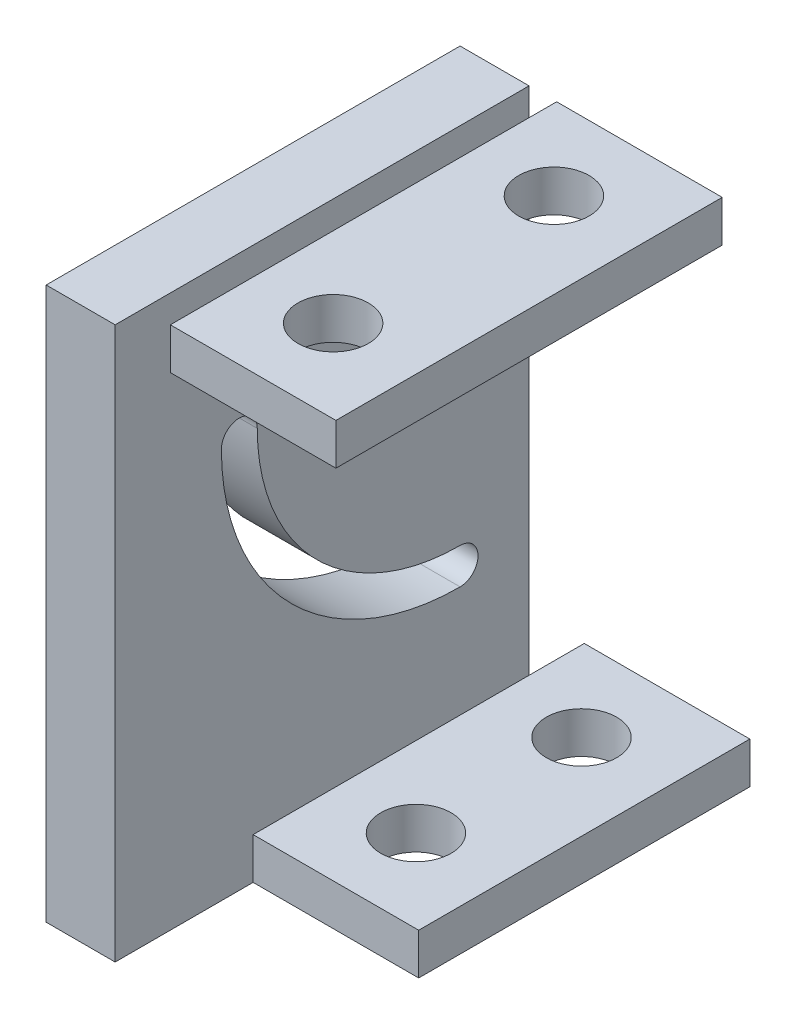
ISO-10303-21;
HEADER;
FILE_DESCRIPTION(('STEP AP214'),'2;1');
FILE_NAME('part.step','',(''),(''),'','','');
FILE_SCHEMA(('AUTOMOTIVE_DESIGN { 1 0 10303 214 1 1 1 1 }'));
ENDSEC;
DATA;
#1=APPLICATION_CONTEXT('core data for automotive mechanical design processes');
#2=APPLICATION_PROTOCOL_DEFINITION('international standard','automotive_design',2000,#1);
#3=PRODUCT_CONTEXT('',#1,'mechanical');
#4=PRODUCT('Part','Part','',(#3));
#5=PRODUCT_RELATED_PRODUCT_CATEGORY('part','',(#4));
#6=PRODUCT_DEFINITION_FORMATION('','',#4);
#7=PRODUCT_DEFINITION_CONTEXT('part definition',#1,'design');
#8=PRODUCT_DEFINITION('design','',#6,#7);
#9=PRODUCT_DEFINITION_SHAPE('','',#8);
#10=(LENGTH_UNIT() NAMED_UNIT(*) SI_UNIT(.MILLI.,.METRE.));
#11=(NAMED_UNIT(*) PLANE_ANGLE_UNIT() SI_UNIT($,.RADIAN.));
#12=(NAMED_UNIT(*) SI_UNIT($,.STERADIAN.) SOLID_ANGLE_UNIT());
#13=UNCERTAINTY_MEASURE_WITH_UNIT(LENGTH_MEASURE(1.E-05),#10,'distance_accuracy_value','');
#14=(GEOMETRIC_REPRESENTATION_CONTEXT(3) GLOBAL_UNCERTAINTY_ASSIGNED_CONTEXT((#13)) GLOBAL_UNIT_ASSIGNED_CONTEXT((#10,
#11,#12)) REPRESENTATION_CONTEXT('',''));
#15=CARTESIAN_POINT('',(0.,0.,0.));
#16=DIRECTION('',(0.,0.,1.));
#17=DIRECTION('',(1.,0.,0.));
#18=AXIS2_PLACEMENT_3D('',#15,#16,#17);
#19=CARTESIAN_POINT('',(27.2,17.,-2.));
#20=DIRECTION('',(1.,0.,0.));
#21=DIRECTION('',(0.,0.,-1.));
#22=AXIS2_PLACEMENT_3D('',#19,#20,#21);
#23=PLANE('',#22);
#24=DIRECTION('',(0.,0.,1.));
#25=VECTOR('',#24,1.);
#26=CARTESIAN_POINT('',(27.2,20.,-2.));
#27=LINE('',#26,#25);
#28=CARTESIAN_POINT('',(27.2,20.,26.));
#29=VERTEX_POINT('',#28);
#30=CARTESIAN_POINT('',(27.2,20.,-2.));
#31=VERTEX_POINT('',#30);
#32=EDGE_CURVE('E113',#29,#31,#27,.F.);
#33=ORIENTED_EDGE('',*,*,#32,.F.);
#34=DIRECTION('',(0.,1.,0.));
#35=VECTOR('',#34,1.);
#36=CARTESIAN_POINT('',(27.2,17.,26.));
#37=LINE('',#36,#35);
#38=CARTESIAN_POINT('',(27.2,17.,26.));
#39=VERTEX_POINT('',#38);
#40=EDGE_CURVE('E120',#39,#29,#37,.T.);
#41=ORIENTED_EDGE('',*,*,#40,.F.);
#42=DIRECTION('',(0.,0.,1.));
#43=VECTOR('',#42,1.);
#44=CARTESIAN_POINT('',(27.2,17.,-2.));
#45=LINE('',#44,#43);
#46=CARTESIAN_POINT('',(27.2,17.,-2.));
#47=VERTEX_POINT('',#46);
#48=EDGE_CURVE('E123',#39,#47,#45,.F.);
#49=ORIENTED_EDGE('',*,*,#48,.T.);
#50=DIRECTION('',(0.,1.,0.));
#51=VECTOR('',#50,1.);
#52=CARTESIAN_POINT('',(27.2,17.,-2.));
#53=LINE('',#52,#51);
#54=EDGE_CURVE('E134',#47,#31,#53,.T.);
#55=ORIENTED_EDGE('',*,*,#54,.T.);
#56=EDGE_LOOP('',(#33,#41,#49,#55));
#57=FACE_BOUND('',#56,.T.);
#58=ADVANCED_FACE('F15',(#57),#23,.T.);
#59=CARTESIAN_POINT('',(21.,20.,4.));
#60=DIRECTION('',(0.,1.,0.));
#61=DIRECTION('',(0.,0.,1.));
#62=AXIS2_PLACEMENT_3D('',#59,#60,#61);
#63=CYLINDRICAL_SURFACE('',#62,2.55);
#64=CARTESIAN_POINT('',(21.,17.,4.));
#65=DIRECTION('',(0.,1.,0.));
#66=DIRECTION('',(0.,0.,1.));
#67=AXIS2_PLACEMENT_3D('',#64,#65,#66);
#68=CIRCLE('',#67,2.55);
#69=CARTESIAN_POINT('',(21.,17.,6.55));
#70=VERTEX_POINT('',#69);
#71=EDGE_CURVE('E18',#70,#70,#68,.F.);
#72=ORIENTED_EDGE('',*,*,#71,.T.);
#73=EDGE_LOOP('',(#72));
#74=FACE_BOUND('',#73,.T.);
#75=CARTESIAN_POINT('',(21.,20.,4.));
#76=DIRECTION('',(0.,1.,0.));
#77=DIRECTION('',(0.,0.,1.));
#78=AXIS2_PLACEMENT_3D('',#75,#76,#77);
#79=CIRCLE('',#78,2.55);
#80=CARTESIAN_POINT('',(21.,20.,6.55));
#81=VERTEX_POINT('',#80);
#82=EDGE_CURVE('E111',#81,#81,#79,.F.);
#83=ORIENTED_EDGE('',*,*,#82,.F.);
#84=EDGE_LOOP('',(#83));
#85=FACE_BOUND('',#84,.T.);
#86=ADVANCED_FACE('F580',(#74,#85),#63,.F.);
#87=CARTESIAN_POINT('',(21.,20.,20.));
#88=DIRECTION('',(0.,1.,0.));
#89=DIRECTION('',(0.,0.,1.));
#90=AXIS2_PLACEMENT_3D('',#87,#88,#89);
#91=CYLINDRICAL_SURFACE('',#90,2.55);
#92=CARTESIAN_POINT('',(21.,17.,20.));
#93=DIRECTION('',(0.,1.,0.));
#94=DIRECTION('',(0.,0.,1.));
#95=AXIS2_PLACEMENT_3D('',#92,#93,#94);
#96=CIRCLE('',#95,2.55);
#97=CARTESIAN_POINT('',(21.,17.,22.55));
#98=VERTEX_POINT('',#97);
#99=EDGE_CURVE('E114',#98,#98,#96,.F.);
#100=ORIENTED_EDGE('',*,*,#99,.T.);
#101=EDGE_LOOP('',(#100));
#102=FACE_BOUND('',#101,.T.);
#103=CARTESIAN_POINT('',(21.,20.,20.));
#104=DIRECTION('',(0.,1.,0.));
#105=DIRECTION('',(0.,0.,1.));
#106=AXIS2_PLACEMENT_3D('',#103,#104,#105);
#107=CIRCLE('',#106,2.55);
#108=CARTESIAN_POINT('',(21.,20.,22.55));
#109=VERTEX_POINT('',#108);
#110=EDGE_CURVE('E107',#109,#109,#107,.F.);
#111=ORIENTED_EDGE('',*,*,#110,.F.);
#112=EDGE_LOOP('',(#111));
#113=FACE_BOUND('',#112,.T.);
#114=ADVANCED_FACE('F572',(#102,#113),#91,.F.);
#115=CARTESIAN_POINT('',(15.2,17.,-2.));
#116=DIRECTION('',(0.,0.,1.));
#117=DIRECTION('',(1.,0.,0.));
#118=AXIS2_PLACEMENT_3D('',#115,#116,#117);
#119=PLANE('',#118);
#120=ORIENTED_EDGE('',*,*,#54,.F.);
#121=DIRECTION('',(1.,0.,0.));
#122=VECTOR('',#121,1.);
#123=CARTESIAN_POINT('',(15.2,17.,-2.));
#124=LINE('',#123,#122);
#125=CARTESIAN_POINT('',(15.2,17.,-2.));
#126=VERTEX_POINT('',#125);
#127=EDGE_CURVE('E127',#47,#126,#124,.F.);
#128=ORIENTED_EDGE('',*,*,#127,.T.);
#129=DIRECTION('',(0.,1.,0.));
#130=VECTOR('',#129,1.);
#131=CARTESIAN_POINT('',(15.2,17.,-2.));
#132=LINE('',#131,#130);
#133=CARTESIAN_POINT('',(15.2,20.,-2.));
#134=VERTEX_POINT('',#133);
#135=EDGE_CURVE('E224',#126,#134,#132,.T.);
#136=ORIENTED_EDGE('',*,*,#135,.T.);
#137=DIRECTION('',(1.,0.,0.));
#138=VECTOR('',#137,1.);
#139=CARTESIAN_POINT('',(15.2,20.,-2.));
#140=LINE('',#139,#138);
#141=EDGE_CURVE('E253',#31,#134,#140,.F.);
#142=ORIENTED_EDGE('',*,*,#141,.F.);
#143=EDGE_LOOP('',(#120,#128,#136,#142));
#144=FACE_BOUND('',#143,.T.);
#145=ADVANCED_FACE('F276',(#144),#119,.F.);
#146=CARTESIAN_POINT('',(15.2,-15.,-4.));
#147=DIRECTION('',(0.,1.,0.));
#148=DIRECTION('',(0.,0.,1.));
#149=AXIS2_PLACEMENT_3D('',#146,#147,#148);
#150=PLANE('',#149);
#151=CARTESIAN_POINT('',(21.,-15.,14.));
#152=DIRECTION('',(0.,1.,0.));
#153=DIRECTION('',(0.,0.,1.));
#154=AXIS2_PLACEMENT_3D('',#151,#152,#153);
#155=CIRCLE('',#154,2.55);
#156=CARTESIAN_POINT('',(21.,-15.,16.55));
#157=VERTEX_POINT('',#156);
#158=EDGE_CURVE('E99',#157,#157,#155,.F.);
#159=ORIENTED_EDGE('',*,*,#158,.T.);
#160=EDGE_LOOP('',(#159));
#161=FACE_BOUND('',#160,.T.);
#162=CARTESIAN_POINT('',(21.,-15.,2.));
#163=DIRECTION('',(0.,1.,0.));
#164=DIRECTION('',(0.,0.,1.));
#165=AXIS2_PLACEMENT_3D('',#162,#163,#164);
#166=CIRCLE('',#165,2.55);
#167=CARTESIAN_POINT('',(21.,-15.,4.55));
#168=VERTEX_POINT('',#167);
#169=EDGE_CURVE('E103',#168,#168,#166,.F.);
#170=ORIENTED_EDGE('',*,*,#169,.T.);
#171=EDGE_LOOP('',(#170));
#172=FACE_BOUND('',#171,.T.);
#173=DIRECTION('',(1.,0.,0.));
#174=VECTOR('',#173,1.);
#175=CARTESIAN_POINT('',(15.2,-15.,20.));
#176=LINE('',#175,#174);
#177=CARTESIAN_POINT('',(27.2,-15.,20.));
#178=VERTEX_POINT('',#177);
#179=CARTESIAN_POINT('',(15.2,-15.,20.));
#180=VERTEX_POINT('',#179);
#181=EDGE_CURVE('E110',#178,#180,#176,.F.);
#182=ORIENTED_EDGE('',*,*,#181,.F.);
#183=DIRECTION('',(0.,0.,-1.));
#184=VECTOR('',#183,1.);
#185=CARTESIAN_POINT('',(27.2,-15.,-4.));
#186=LINE('',#185,#184);
#187=CARTESIAN_POINT('',(27.2,-15.,-4.));
#188=VERTEX_POINT('',#187);
#189=EDGE_CURVE('E243',#188,#178,#186,.F.);
#190=ORIENTED_EDGE('',*,*,#189,.F.);
#191=DIRECTION('',(1.,0.,0.));
#192=VECTOR('',#191,1.);
#193=CARTESIAN_POINT('',(15.2,-15.,-4.));
#194=LINE('',#193,#192);
#195=CARTESIAN_POINT('',(15.2,-15.,-4.));
#196=VERTEX_POINT('',#195);
#197=EDGE_CURVE('E106',#188,#196,#194,.F.);
#198=ORIENTED_EDGE('',*,*,#197,.T.);
#199=DIRECTION('',(0.,0.,-1.));
#200=VECTOR('',#199,1.);
#201=CARTESIAN_POINT('',(15.2,-15.,-4.));
#202=LINE('',#201,#200);
#203=CARTESIAN_POINT('',(15.2,-15.,0.));
#204=VERTEX_POINT('',#203);
#205=EDGE_CURVE('E230',#196,#204,#202,.F.);
#206=ORIENTED_EDGE('',*,*,#205,.T.);
#207=DIRECTION('',(0.,0.,-1.));
#208=VECTOR('',#207,1.);
#209=CARTESIAN_POINT('',(15.2,-15.,0.));
#210=LINE('',#209,#208);
#211=EDGE_CURVE('E215',#180,#204,#210,.T.);
#212=ORIENTED_EDGE('',*,*,#211,.F.);
#213=EDGE_LOOP('',(#182,#190,#198,#206,#212));
#214=FACE_BOUND('',#213,.T.);
#215=ADVANCED_FACE('F330',(#161,#172,#214),#150,.T.);
#216=CARTESIAN_POINT('',(15.2,17.,-2.));
#217=DIRECTION('',(0.,1.,0.));
#218=DIRECTION('',(0.,0.,1.));
#219=AXIS2_PLACEMENT_3D('',#216,#217,#218);
#220=PLANE('',#219);
#221=ORIENTED_EDGE('',*,*,#99,.F.);
#222=EDGE_LOOP('',(#221));
#223=FACE_BOUND('',#222,.T.);
#224=ORIENTED_EDGE('',*,*,#71,.F.);
#225=EDGE_LOOP('',(#224));
#226=FACE_BOUND('',#225,.T.);
#227=DIRECTION('',(1.,0.,0.));
#228=VECTOR('',#227,1.);
#229=CARTESIAN_POINT('',(15.2,17.,26.));
#230=LINE('',#229,#228);
#231=CARTESIAN_POINT('',(15.2,17.,26.));
#232=VERTEX_POINT('',#231);
#233=EDGE_CURVE('E116',#232,#39,#230,.T.);
#234=ORIENTED_EDGE('',*,*,#233,.F.);
#235=DIRECTION('',(0.,0.,-1.));
#236=VECTOR('',#235,1.);
#237=CARTESIAN_POINT('',(15.2,17.,0.));
#238=LINE('',#237,#236);
#239=CARTESIAN_POINT('',(15.2,17.,0.));
#240=VERTEX_POINT('',#239);
#241=EDGE_CURVE('E212',#240,#232,#238,.F.);
#242=ORIENTED_EDGE('',*,*,#241,.F.);
#243=DIRECTION('',(0.,0.,-1.));
#244=VECTOR('',#243,1.);
#245=CARTESIAN_POINT('',(15.2,17.,-2.));
#246=LINE('',#245,#244);
#247=EDGE_CURVE('E227',#240,#126,#246,.T.);
#248=ORIENTED_EDGE('',*,*,#247,.T.);
#249=ORIENTED_EDGE('',*,*,#127,.F.);
#250=ORIENTED_EDGE('',*,*,#48,.F.);
#251=EDGE_LOOP('',(#234,#242,#248,#249,#250));
#252=FACE_BOUND('',#251,.T.);
#253=ADVANCED_FACE('F280',(#223,#226,#252),#220,.F.);
#254=CARTESIAN_POINT('',(15.2,17.,26.));
#255=DIRECTION('',(0.,0.,1.));
#256=DIRECTION('',(1.,0.,0.));
#257=AXIS2_PLACEMENT_3D('',#254,#255,#256);
#258=PLANE('',#257);
#259=ORIENTED_EDGE('',*,*,#40,.T.);
#260=DIRECTION('',(1.,0.,0.));
#261=VECTOR('',#260,1.);
#262=CARTESIAN_POINT('',(15.2,20.,26.));
#263=LINE('',#262,#261);
#264=CARTESIAN_POINT('',(15.2,20.,26.));
#265=VERTEX_POINT('',#264);
#266=EDGE_CURVE('E250',#265,#29,#263,.T.);
#267=ORIENTED_EDGE('',*,*,#266,.F.);
#268=DIRECTION('',(0.,1.,0.));
#269=VECTOR('',#268,1.);
#270=CARTESIAN_POINT('',(15.2,-18.,26.));
#271=LINE('',#270,#269);
#272=EDGE_CURVE('E209',#232,#265,#271,.T.);
#273=ORIENTED_EDGE('',*,*,#272,.F.);
#274=ORIENTED_EDGE('',*,*,#233,.T.);
#275=EDGE_LOOP('',(#259,#267,#273,#274));
#276=FACE_BOUND('',#275,.T.);
#277=ADVANCED_FACE('F259',(#276),#258,.T.);
#278=CARTESIAN_POINT('',(15.2,20.,-2.));
#279=DIRECTION('',(0.,1.,0.));
#280=DIRECTION('',(0.,0.,1.));
#281=AXIS2_PLACEMENT_3D('',#278,#279,#280);
#282=PLANE('',#281);
#283=ORIENTED_EDGE('',*,*,#110,.T.);
#284=EDGE_LOOP('',(#283));
#285=FACE_BOUND('',#284,.T.);
#286=ORIENTED_EDGE('',*,*,#82,.T.);
#287=EDGE_LOOP('',(#286));
#288=FACE_BOUND('',#287,.T.);
#289=ORIENTED_EDGE('',*,*,#266,.T.);
#290=ORIENTED_EDGE('',*,*,#32,.T.);
#291=ORIENTED_EDGE('',*,*,#141,.T.);
#292=DIRECTION('',(0.,0.,-1.));
#293=VECTOR('',#292,1.);
#294=CARTESIAN_POINT('',(15.2,20.,-2.));
#295=LINE('',#294,#293);
#296=CARTESIAN_POINT('',(15.2,20.,0.));
#297=VERTEX_POINT('',#296);
#298=EDGE_CURVE('E221',#134,#297,#295,.F.);
#299=ORIENTED_EDGE('',*,*,#298,.T.);
#300=DIRECTION('',(0.,0.,-1.));
#301=VECTOR('',#300,1.);
#302=CARTESIAN_POINT('',(15.2,20.,0.));
#303=LINE('',#302,#301);
#304=EDGE_CURVE('E206',#265,#297,#303,.T.);
#305=ORIENTED_EDGE('',*,*,#304,.F.);
#306=EDGE_LOOP('',(#289,#290,#291,#299,#305));
#307=FACE_BOUND('',#306,.T.);
#308=ADVANCED_FACE('F270',(#285,#288,#307),#282,.T.);
#309=CARTESIAN_POINT('',(15.2,-18.,20.));
#310=DIRECTION('',(0.,0.,1.));
#311=DIRECTION('',(1.,0.,0.));
#312=AXIS2_PLACEMENT_3D('',#309,#310,#311);
#313=PLANE('',#312);
#314=DIRECTION('',(0.,1.,0.));
#315=VECTOR('',#314,1.);
#316=CARTESIAN_POINT('',(27.2,-18.,20.));
#317=LINE('',#316,#315);
#318=CARTESIAN_POINT('',(27.2,-18.,20.));
#319=VERTEX_POINT('',#318);
#320=EDGE_CURVE('E240',#178,#319,#317,.F.);
#321=ORIENTED_EDGE('',*,*,#320,.F.);
#322=ORIENTED_EDGE('',*,*,#181,.T.);
#323=DIRECTION('',(0.,1.,0.));
#324=VECTOR('',#323,1.);
#325=CARTESIAN_POINT('',(15.2,-18.,20.));
#326=LINE('',#325,#324);
#327=CARTESIAN_POINT('',(15.2,-18.,20.));
#328=VERTEX_POINT('',#327);
#329=EDGE_CURVE('E218',#328,#180,#326,.T.);
#330=ORIENTED_EDGE('',*,*,#329,.F.);
#331=DIRECTION('',(1.,0.,0.));
#332=VECTOR('',#331,1.);
#333=CARTESIAN_POINT('',(10.2,-18.,20.));
#334=LINE('',#333,#332);
#335=EDGE_CURVE('E200',#328,#319,#334,.T.);
#336=ORIENTED_EDGE('',*,*,#335,.T.);
#337=EDGE_LOOP('',(#321,#322,#330,#336));
#338=FACE_BOUND('',#337,.T.);
#339=ADVANCED_FACE('F332',(#338),#313,.T.);
#340=CARTESIAN_POINT('',(27.2,-18.,-4.));
#341=DIRECTION('',(1.,0.,0.));
#342=DIRECTION('',(0.,0.,-1.));
#343=AXIS2_PLACEMENT_3D('',#340,#341,#342);
#344=PLANE('',#343);
#345=ORIENTED_EDGE('',*,*,#189,.T.);
#346=ORIENTED_EDGE('',*,*,#320,.T.);
#347=DIRECTION('',(0.,0.,1.));
#348=VECTOR('',#347,1.);
#349=CARTESIAN_POINT('',(27.2,-18.,0.));
#350=LINE('',#349,#348);
#351=CARTESIAN_POINT('',(27.2,-18.,-4.));
#352=VERTEX_POINT('',#351);
#353=EDGE_CURVE('E197',#319,#352,#350,.F.);
#354=ORIENTED_EDGE('',*,*,#353,.T.);
#355=DIRECTION('',(0.,1.,0.));
#356=VECTOR('',#355,1.);
#357=CARTESIAN_POINT('',(27.2,-18.,-4.));
#358=LINE('',#357,#356);
#359=EDGE_CURVE('E237',#352,#188,#358,.T.);
#360=ORIENTED_EDGE('',*,*,#359,.T.);
#361=EDGE_LOOP('',(#345,#346,#354,#360));
#362=FACE_BOUND('',#361,.T.);
#363=ADVANCED_FACE('F324',(#362),#344,.T.);
#364=CARTESIAN_POINT('',(15.2,-18.,-4.));
#365=DIRECTION('',(0.,0.,1.));
#366=DIRECTION('',(1.,0.,0.));
#367=AXIS2_PLACEMENT_3D('',#364,#365,#366);
#368=PLANE('',#367);
#369=ORIENTED_EDGE('',*,*,#359,.F.);
#370=DIRECTION('',(1.,0.,0.));
#371=VECTOR('',#370,1.);
#372=CARTESIAN_POINT('',(10.2,-18.,-4.));
#373=LINE('',#372,#371);
#374=CARTESIAN_POINT('',(15.2,-18.,-4.));
#375=VERTEX_POINT('',#374);
#376=EDGE_CURVE('E194',#352,#375,#373,.F.);
#377=ORIENTED_EDGE('',*,*,#376,.T.);
#378=DIRECTION('',(0.,1.,0.));
#379=VECTOR('',#378,1.);
#380=CARTESIAN_POINT('',(15.2,-18.,-4.));
#381=LINE('',#380,#379);
#382=EDGE_CURVE('E102',#375,#196,#381,.T.);
#383=ORIENTED_EDGE('',*,*,#382,.T.);
#384=ORIENTED_EDGE('',*,*,#197,.F.);
#385=EDGE_LOOP('',(#369,#377,#383,#384));
#386=FACE_BOUND('',#385,.T.);
#387=ADVANCED_FACE('F370',(#386),#368,.F.);
#388=CARTESIAN_POINT('',(21.,-15.,2.));
#389=DIRECTION('',(0.,1.,0.));
#390=DIRECTION('',(0.,0.,1.));
#391=AXIS2_PLACEMENT_3D('',#388,#389,#390);
#392=CYLINDRICAL_SURFACE('',#391,2.55);
#393=CARTESIAN_POINT('',(21.,-18.,2.));
#394=DIRECTION('',(0.,1.,0.));
#395=DIRECTION('',(0.,0.,1.));
#396=AXIS2_PLACEMENT_3D('',#393,#394,#395);
#397=CIRCLE('',#396,2.55);
#398=CARTESIAN_POINT('',(21.,-18.,4.55));
#399=VERTEX_POINT('',#398);
#400=EDGE_CURVE('E95',#399,#399,#397,.F.);
#401=ORIENTED_EDGE('',*,*,#400,.T.);
#402=EDGE_LOOP('',(#401));
#403=FACE_BOUND('',#402,.T.);
#404=ORIENTED_EDGE('',*,*,#169,.F.);
#405=EDGE_LOOP('',(#404));
#406=FACE_BOUND('',#405,.T.);
#407=ADVANCED_FACE('F383',(#403,#406),#392,.F.);
#408=CARTESIAN_POINT('',(21.,-15.,14.));
#409=DIRECTION('',(0.,1.,0.));
#410=DIRECTION('',(0.,0.,1.));
#411=AXIS2_PLACEMENT_3D('',#408,#409,#410);
#412=CYLINDRICAL_SURFACE('',#411,2.55);
#413=CARTESIAN_POINT('',(21.,-18.,14.));
#414=DIRECTION('',(0.,1.,0.));
#415=DIRECTION('',(0.,0.,1.));
#416=AXIS2_PLACEMENT_3D('',#413,#414,#415);
#417=CIRCLE('',#416,2.55);
#418=CARTESIAN_POINT('',(21.,-18.,16.55));
#419=VERTEX_POINT('',#418);
#420=EDGE_CURVE('E91',#419,#419,#417,.F.);
#421=ORIENTED_EDGE('',*,*,#420,.T.);
#422=EDGE_LOOP('',(#421));
#423=FACE_BOUND('',#422,.T.);
#424=ORIENTED_EDGE('',*,*,#158,.F.);
#425=EDGE_LOOP('',(#424));
#426=FACE_BOUND('',#425,.T.);
#427=ADVANCED_FACE('F375',(#423,#426),#412,.F.);
#428=CARTESIAN_POINT('',(15.2,-18.,-4.));
#429=DIRECTION('',(1.,0.,0.));
#430=DIRECTION('',(0.,0.,-1.));
#431=AXIS2_PLACEMENT_3D('',#428,#429,#430);
#432=PLANE('',#431);
#433=ORIENTED_EDGE('',*,*,#205,.F.);
#434=ORIENTED_EDGE('',*,*,#382,.F.);
#435=DIRECTION('',(0.,0.,1.));
#436=VECTOR('',#435,1.);
#437=CARTESIAN_POINT('',(15.2,-18.,0.));
#438=LINE('',#437,#436);
#439=CARTESIAN_POINT('',(15.2,-18.,0.));
#440=VERTEX_POINT('',#439);
#441=EDGE_CURVE('E98',#375,#440,#438,.T.);
#442=ORIENTED_EDGE('',*,*,#441,.T.);
#443=DIRECTION('',(0.,1.,0.));
#444=VECTOR('',#443,1.);
#445=CARTESIAN_POINT('',(15.2,-18.,0.));
#446=LINE('',#445,#444);
#447=EDGE_CURVE('E187',#440,#204,#446,.T.);
#448=ORIENTED_EDGE('',*,*,#447,.T.);
#449=EDGE_LOOP('',(#433,#434,#442,#448));
#450=FACE_BOUND('',#449,.T.);
#451=ADVANCED_FACE('F373',(#450),#432,.F.);
#452=CARTESIAN_POINT('',(15.2,17.,-2.));
#453=DIRECTION('',(1.,0.,0.));
#454=DIRECTION('',(0.,0.,-1.));
#455=AXIS2_PLACEMENT_3D('',#452,#453,#454);
#456=PLANE('',#455);
#457=ORIENTED_EDGE('',*,*,#298,.F.);
#458=ORIENTED_EDGE('',*,*,#135,.F.);
#459=ORIENTED_EDGE('',*,*,#247,.F.);
#460=DIRECTION('',(0.,1.,0.));
#461=VECTOR('',#460,1.);
#462=CARTESIAN_POINT('',(15.2,-18.,0.));
#463=LINE('',#462,#461);
#464=EDGE_CURVE('E181',#240,#297,#463,.T.);
#465=ORIENTED_EDGE('',*,*,#464,.T.);
#466=EDGE_LOOP('',(#457,#458,#459,#465));
#467=FACE_BOUND('',#466,.T.);
#468=ADVANCED_FACE('F290',(#467),#456,.F.);
#469=CARTESIAN_POINT('',(15.2,-18.,0.));
#470=DIRECTION('',(1.,0.,0.));
#471=DIRECTION('',(0.,0.,-1.));
#472=AXIS2_PLACEMENT_3D('',#469,#470,#471);
#473=PLANE('',#472);
#474=CARTESIAN_POINT('',(15.2,10.35,21.));
#475=DIRECTION('',(-1.,0.,0.));
#476=DIRECTION('',(0.,0.,1.));
#477=AXIS2_PLACEMENT_3D('',#474,#475,#476);
#478=CIRCLE('',#477,1.3);
#479=CARTESIAN_POINT('',(15.2,10.35,22.3));
#480=VERTEX_POINT('',#479);
#481=CARTESIAN_POINT('',(15.2,10.35,19.7));
#482=VERTEX_POINT('',#481);
#483=EDGE_CURVE('E72',#480,#482,#478,.T.);
#484=ORIENTED_EDGE('',*,*,#483,.T.);
#485=CARTESIAN_POINT('',(15.2,10.35,5.));
#486=DIRECTION('',(-1.,0.,0.));
#487=DIRECTION('',(0.,0.,1.));
#488=AXIS2_PLACEMENT_3D('',#485,#486,#487);
#489=CIRCLE('',#488,14.7);
#490=CARTESIAN_POINT('',(15.2,-4.35,5.));
#491=VERTEX_POINT('',#490);
#492=EDGE_CURVE('E70',#491,#482,#489,.T.);
#493=ORIENTED_EDGE('',*,*,#492,.F.);
#494=CARTESIAN_POINT('',(15.2,-5.65,5.));
#495=DIRECTION('',(-1.,0.,0.));
#496=DIRECTION('',(0.,0.,1.));
#497=AXIS2_PLACEMENT_3D('',#494,#495,#496);
#498=CIRCLE('',#497,1.3);
#499=CARTESIAN_POINT('',(15.2,-6.95,5.));
#500=VERTEX_POINT('',#499);
#501=EDGE_CURVE('E58',#491,#500,#498,.T.);
#502=ORIENTED_EDGE('',*,*,#501,.T.);
#503=CARTESIAN_POINT('',(15.2,10.35,5.));
#504=DIRECTION('',(-1.,0.,0.));
#505=DIRECTION('',(0.,0.,1.));
#506=AXIS2_PLACEMENT_3D('',#503,#504,#505);
#507=CIRCLE('',#506,17.3);
#508=EDGE_CURVE('E86',#500,#480,#507,.T.);
#509=ORIENTED_EDGE('',*,*,#508,.T.);
#510=EDGE_LOOP('',(#484,#493,#502,#509));
#511=FACE_BOUND('',#510,.T.);
#512=CARTESIAN_POINT('',(15.2,10.35,5.));
#513=DIRECTION('',(-1.,0.,0.));
#514=DIRECTION('',(0.,0.,1.));
#515=AXIS2_PLACEMENT_3D('',#512,#513,#514);
#516=CIRCLE('',#515,1.2);
#517=CARTESIAN_POINT('',(15.2,10.35,6.2));
#518=VERTEX_POINT('',#517);
#519=EDGE_CURVE('E67',#518,#518,#516,.T.);
#520=ORIENTED_EDGE('',*,*,#519,.T.);
#521=EDGE_LOOP('',(#520));
#522=FACE_BOUND('',#521,.T.);
#523=DIRECTION('',(0.,0.,1.));
#524=VECTOR('',#523,1.);
#525=CARTESIAN_POINT('',(15.2,22.,0.));
#526=LINE('',#525,#524);
#527=CARTESIAN_POINT('',(15.2,22.,30.));
#528=VERTEX_POINT('',#527);
#529=CARTESIAN_POINT('',(15.2,22.,0.));
#530=VERTEX_POINT('',#529);
#531=EDGE_CURVE('E172',#528,#530,#526,.F.);
#532=ORIENTED_EDGE('',*,*,#531,.F.);
#533=DIRECTION('',(0.,1.,0.));
#534=VECTOR('',#533,1.);
#535=CARTESIAN_POINT('',(15.2,-18.,30.));
#536=LINE('',#535,#534);
#537=CARTESIAN_POINT('',(15.2,-18.,30.));
#538=VERTEX_POINT('',#537);
#539=EDGE_CURVE('E167',#538,#528,#536,.T.);
#540=ORIENTED_EDGE('',*,*,#539,.F.);
#541=DIRECTION('',(0.,0.,1.));
#542=VECTOR('',#541,1.);
#543=CARTESIAN_POINT('',(15.2,-18.,0.));
#544=LINE('',#543,#542);
#545=EDGE_CURVE('E203',#538,#328,#544,.F.);
#546=ORIENTED_EDGE('',*,*,#545,.T.);
#547=ORIENTED_EDGE('',*,*,#329,.T.);
#548=ORIENTED_EDGE('',*,*,#211,.T.);
#549=DIRECTION('',(0.,1.,0.));
#550=VECTOR('',#549,1.);
#551=CARTESIAN_POINT('',(15.2,-18.,0.));
#552=LINE('',#551,#550);
#553=EDGE_CURVE('E184',#204,#240,#552,.T.);
#554=ORIENTED_EDGE('',*,*,#553,.T.);
#555=ORIENTED_EDGE('',*,*,#241,.T.);
#556=ORIENTED_EDGE('',*,*,#272,.T.);
#557=ORIENTED_EDGE('',*,*,#304,.T.);
#558=DIRECTION('',(0.,1.,0.));
#559=VECTOR('',#558,1.);
#560=CARTESIAN_POINT('',(15.2,-18.,0.));
#561=LINE('',#560,#559);
#562=EDGE_CURVE('E178',#297,#530,#561,.T.);
#563=ORIENTED_EDGE('',*,*,#562,.T.);
#564=EDGE_LOOP('',(#532,#540,#546,#547,#548,#554,#555,#556,#557,#563));
#565=FACE_BOUND('',#564,.T.);
#566=ADVANCED_FACE('F74',(#511,#522,#565),#473,.T.);
#567=CARTESIAN_POINT('',(10.2,-18.,0.));
#568=DIRECTION('',(0.,1.,0.));
#569=DIRECTION('',(0.,0.,1.));
#570=AXIS2_PLACEMENT_3D('',#567,#568,#569);
#571=PLANE('',#570);
#572=ORIENTED_EDGE('',*,*,#420,.F.);
#573=EDGE_LOOP('',(#572));
#574=FACE_BOUND('',#573,.T.);
#575=ORIENTED_EDGE('',*,*,#400,.F.);
#576=EDGE_LOOP('',(#575));
#577=FACE_BOUND('',#576,.T.);
#578=ORIENTED_EDGE('',*,*,#376,.F.);
#579=ORIENTED_EDGE('',*,*,#353,.F.);
#580=ORIENTED_EDGE('',*,*,#335,.F.);
#581=ORIENTED_EDGE('',*,*,#545,.F.);
#582=DIRECTION('',(1.,0.,0.));
#583=VECTOR('',#582,1.);
#584=CARTESIAN_POINT('',(10.2,-18.,30.));
#585=LINE('',#584,#583);
#586=CARTESIAN_POINT('',(10.2,-18.,30.));
#587=VERTEX_POINT('',#586);
#588=EDGE_CURVE('E170',#587,#538,#585,.T.);
#589=ORIENTED_EDGE('',*,*,#588,.F.);
#590=DIRECTION('',(0.,0.,-1.));
#591=VECTOR('',#590,1.);
#592=CARTESIAN_POINT('',(10.2,-18.,0.));
#593=LINE('',#592,#591);
#594=CARTESIAN_POINT('',(10.2,-18.,0.));
#595=VERTEX_POINT('',#594);
#596=EDGE_CURVE('E78',#587,#595,#593,.T.);
#597=ORIENTED_EDGE('',*,*,#596,.T.);
#598=DIRECTION('',(1.,0.,0.));
#599=VECTOR('',#598,1.);
#600=CARTESIAN_POINT('',(10.2,-18.,0.));
#601=LINE('',#600,#599);
#602=EDGE_CURVE('E94',#595,#440,#601,.T.);
#603=ORIENTED_EDGE('',*,*,#602,.T.);
#604=ORIENTED_EDGE('',*,*,#441,.F.);
#605=EDGE_LOOP('',(#578,#579,#580,#581,#589,#597,#603,#604));
#606=FACE_BOUND('',#605,.T.);
#607=ADVANCED_FACE('F337',(#574,#577,#606),#571,.F.);
#608=CARTESIAN_POINT('',(10.2,-18.,0.));
#609=DIRECTION('',(0.,0.,1.));
#610=DIRECTION('',(1.,0.,0.));
#611=AXIS2_PLACEMENT_3D('',#608,#609,#610);
#612=PLANE('',#611);
#613=ORIENTED_EDGE('',*,*,#562,.F.);
#614=ORIENTED_EDGE('',*,*,#464,.F.);
#615=ORIENTED_EDGE('',*,*,#553,.F.);
#616=ORIENTED_EDGE('',*,*,#447,.F.);
#617=ORIENTED_EDGE('',*,*,#602,.F.);
#618=DIRECTION('',(0.,1.,0.));
#619=VECTOR('',#618,1.);
#620=CARTESIAN_POINT('',(10.2,-18.,0.));
#621=LINE('',#620,#619);
#622=CARTESIAN_POINT('',(10.2,22.,0.));
#623=VERTEX_POINT('',#622);
#624=EDGE_CURVE('E156',#595,#623,#621,.T.);
#625=ORIENTED_EDGE('',*,*,#624,.T.);
#626=DIRECTION('',(1.,0.,0.));
#627=VECTOR('',#626,1.);
#628=CARTESIAN_POINT('',(10.2,22.,0.));
#629=LINE('',#628,#627);
#630=EDGE_CURVE('E175',#530,#623,#629,.F.);
#631=ORIENTED_EDGE('',*,*,#630,.F.);
#632=EDGE_LOOP('',(#613,#614,#615,#616,#617,#625,#631));
#633=FACE_BOUND('',#632,.T.);
#634=ADVANCED_FACE('F358',(#633),#612,.F.);
#635=CARTESIAN_POINT('',(10.2,22.,0.));
#636=DIRECTION('',(0.,1.,0.));
#637=DIRECTION('',(0.,0.,1.));
#638=AXIS2_PLACEMENT_3D('',#635,#636,#637);
#639=PLANE('',#638);
#640=DIRECTION('',(1.,0.,0.));
#641=VECTOR('',#640,1.);
#642=CARTESIAN_POINT('',(10.2,22.,30.));
#643=LINE('',#642,#641);
#644=CARTESIAN_POINT('',(10.2,22.,30.));
#645=VERTEX_POINT('',#644);
#646=EDGE_CURVE('E90',#528,#645,#643,.F.);
#647=ORIENTED_EDGE('',*,*,#646,.F.);
#648=ORIENTED_EDGE('',*,*,#531,.T.);
#649=ORIENTED_EDGE('',*,*,#630,.T.);
#650=DIRECTION('',(0.,0.,-1.));
#651=VECTOR('',#650,1.);
#652=CARTESIAN_POINT('',(10.2,22.,0.));
#653=LINE('',#652,#651);
#654=EDGE_CURVE('E149',#623,#645,#653,.F.);
#655=ORIENTED_EDGE('',*,*,#654,.T.);
#656=EDGE_LOOP('',(#647,#648,#649,#655));
#657=FACE_BOUND('',#656,.T.);
#658=ADVANCED_FACE('F355',(#657),#639,.T.);
#659=CARTESIAN_POINT('',(10.2,-18.,30.));
#660=DIRECTION('',(0.,0.,1.));
#661=DIRECTION('',(1.,0.,0.));
#662=AXIS2_PLACEMENT_3D('',#659,#660,#661);
#663=PLANE('',#662);
#664=ORIENTED_EDGE('',*,*,#539,.T.);
#665=ORIENTED_EDGE('',*,*,#646,.T.);
#666=DIRECTION('',(0.,1.,0.));
#667=VECTOR('',#666,1.);
#668=CARTESIAN_POINT('',(10.2,-18.,30.));
#669=LINE('',#668,#667);
#670=EDGE_CURVE('E145',#645,#587,#669,.F.);
#671=ORIENTED_EDGE('',*,*,#670,.T.);
#672=ORIENTED_EDGE('',*,*,#588,.T.);
#673=EDGE_LOOP('',(#664,#665,#671,#672));
#674=FACE_BOUND('',#673,.T.);
#675=ADVANCED_FACE('F346',(#674),#663,.T.);
#676=CARTESIAN_POINT('',(9.7,10.35,5.));
#677=DIRECTION('',(-1.,0.,0.));
#678=DIRECTION('',(0.,0.,1.));
#679=AXIS2_PLACEMENT_3D('',#676,#677,#678);
#680=CYLINDRICAL_SURFACE('',#679,1.2);
#681=ORIENTED_EDGE('',*,*,#519,.F.);
#682=EDGE_LOOP('',(#681));
#683=FACE_BOUND('',#682,.T.);
#684=CARTESIAN_POINT('',(10.2,10.35,5.));
#685=DIRECTION('',(-1.,0.,0.));
#686=DIRECTION('',(0.,0.,1.));
#687=AXIS2_PLACEMENT_3D('',#684,#685,#686);
#688=CIRCLE('',#687,1.2);
#689=CARTESIAN_POINT('',(10.2,10.35,6.2));
#690=VERTEX_POINT('',#689);
#691=EDGE_CURVE('E82',#690,#690,#688,.T.);
#692=ORIENTED_EDGE('',*,*,#691,.T.);
#693=EDGE_LOOP('',(#692));
#694=FACE_BOUND('',#693,.T.);
#695=ADVANCED_FACE('F406',(#683,#694),#680,.F.);
#696=CARTESIAN_POINT('',(9.7,-5.65,5.));
#697=DIRECTION('',(-1.,0.,0.));
#698=DIRECTION('',(0.,0.,1.));
#699=AXIS2_PLACEMENT_3D('',#696,#697,#698);
#700=CYLINDRICAL_SURFACE('',#699,1.3);
#701=CARTESIAN_POINT('',(10.2,-5.65,5.));
#702=DIRECTION('',(-1.,0.,0.));
#703=DIRECTION('',(0.,0.,1.));
#704=AXIS2_PLACEMENT_3D('',#701,#702,#703);
#705=CIRCLE('',#704,1.3);
#706=CARTESIAN_POINT('',(10.2,-4.35,5.));
#707=VERTEX_POINT('',#706);
#708=CARTESIAN_POINT('',(10.2,-6.95,5.));
#709=VERTEX_POINT('',#708);
#710=EDGE_CURVE('E143',#707,#709,#705,.T.);
#711=ORIENTED_EDGE('',*,*,#710,.T.);
#712=DIRECTION('',(-1.,0.,0.));
#713=VECTOR('',#712,1.);
#714=CARTESIAN_POINT('',(9.7,-6.95,5.));
#715=LINE('',#714,#713);
#716=EDGE_CURVE('E63',#709,#500,#715,.F.);
#717=ORIENTED_EDGE('',*,*,#716,.T.);
#718=ORIENTED_EDGE('',*,*,#501,.F.);
#719=DIRECTION('',(-1.,0.,0.));
#720=VECTOR('',#719,1.);
#721=CARTESIAN_POINT('',(9.7,-4.35,5.));
#722=LINE('',#721,#720);
#723=EDGE_CURVE('E62',#707,#491,#722,.F.);
#724=ORIENTED_EDGE('',*,*,#723,.F.);
#725=EDGE_LOOP('',(#711,#717,#718,#724));
#726=FACE_BOUND('',#725,.T.);
#727=ADVANCED_FACE('F61',(#726),#700,.F.);
#728=CARTESIAN_POINT('',(9.7,10.35,5.));
#729=DIRECTION('',(-1.,0.,0.));
#730=DIRECTION('',(0.,0.,1.));
#731=AXIS2_PLACEMENT_3D('',#728,#729,#730);
#732=CYLINDRICAL_SURFACE('',#731,17.3);
#733=DIRECTION('',(-1.,0.,0.));
#734=VECTOR('',#733,1.);
#735=CARTESIAN_POINT('',(9.7,10.35,22.3));
#736=LINE('',#735,#734);
#737=CARTESIAN_POINT('',(10.2,10.35,22.3));
#738=VERTEX_POINT('',#737);
#739=EDGE_CURVE('E85',#738,#480,#736,.F.);
#740=ORIENTED_EDGE('',*,*,#739,.T.);
#741=ORIENTED_EDGE('',*,*,#508,.F.);
#742=ORIENTED_EDGE('',*,*,#716,.F.);
#743=CARTESIAN_POINT('',(10.2,10.35,5.));
#744=DIRECTION('',(-1.,0.,0.));
#745=DIRECTION('',(0.,0.,1.));
#746=AXIS2_PLACEMENT_3D('',#743,#744,#745);
#747=CIRCLE('',#746,17.3);
#748=EDGE_CURVE('E141',#709,#738,#747,.T.);
#749=ORIENTED_EDGE('',*,*,#748,.T.);
#750=EDGE_LOOP('',(#740,#741,#742,#749));
#751=FACE_BOUND('',#750,.T.);
#752=ADVANCED_FACE('F399',(#751),#732,.F.);
#753=CARTESIAN_POINT('',(9.7,10.35,21.));
#754=DIRECTION('',(-1.,0.,0.));
#755=DIRECTION('',(0.,0.,1.));
#756=AXIS2_PLACEMENT_3D('',#753,#754,#755);
#757=CYLINDRICAL_SURFACE('',#756,1.3);
#758=DIRECTION('',(-1.,0.,0.));
#759=VECTOR('',#758,1.);
#760=CARTESIAN_POINT('',(9.7,10.35,19.7));
#761=LINE('',#760,#759);
#762=CARTESIAN_POINT('',(10.2,10.35,19.7));
#763=VERTEX_POINT('',#762);
#764=EDGE_CURVE('E32',#482,#763,#761,.T.);
#765=ORIENTED_EDGE('',*,*,#764,.F.);
#766=ORIENTED_EDGE('',*,*,#483,.F.);
#767=ORIENTED_EDGE('',*,*,#739,.F.);
#768=CARTESIAN_POINT('',(10.2,10.35,21.));
#769=DIRECTION('',(-1.,0.,0.));
#770=DIRECTION('',(0.,0.,1.));
#771=AXIS2_PLACEMENT_3D('',#768,#769,#770);
#772=CIRCLE('',#771,1.3);
#773=EDGE_CURVE('E24',#738,#763,#772,.T.);
#774=ORIENTED_EDGE('',*,*,#773,.T.);
#775=EDGE_LOOP('',(#765,#766,#767,#774));
#776=FACE_BOUND('',#775,.T.);
#777=ADVANCED_FACE('F392',(#776),#757,.F.);
#778=CARTESIAN_POINT('',(9.7,10.35,5.));
#779=DIRECTION('',(-1.,0.,0.));
#780=DIRECTION('',(0.,0.,1.));
#781=AXIS2_PLACEMENT_3D('',#778,#779,#780);
#782=CYLINDRICAL_SURFACE('',#781,14.7);
#783=ORIENTED_EDGE('',*,*,#492,.T.);
#784=ORIENTED_EDGE('',*,*,#764,.T.);
#785=CARTESIAN_POINT('',(10.2,10.35,5.));
#786=DIRECTION('',(-1.,0.,0.));
#787=DIRECTION('',(0.,0.,1.));
#788=AXIS2_PLACEMENT_3D('',#785,#786,#787);
#789=CIRCLE('',#788,14.7);
#790=EDGE_CURVE('E9',#763,#707,#789,.F.);
#791=ORIENTED_EDGE('',*,*,#790,.T.);
#792=ORIENTED_EDGE('',*,*,#723,.T.);
#793=EDGE_LOOP('',(#783,#784,#791,#792));
#794=FACE_BOUND('',#793,.T.);
#795=ADVANCED_FACE('F69',(#794),#782,.T.);
#796=CARTESIAN_POINT('',(10.2,-18.,0.));
#797=DIRECTION('',(1.,0.,0.));
#798=DIRECTION('',(0.,0.,-1.));
#799=AXIS2_PLACEMENT_3D('',#796,#797,#798);
#800=PLANE('',#799);
#801=ORIENTED_EDGE('',*,*,#773,.F.);
#802=ORIENTED_EDGE('',*,*,#748,.F.);
#803=ORIENTED_EDGE('',*,*,#710,.F.);
#804=ORIENTED_EDGE('',*,*,#790,.F.);
#805=EDGE_LOOP('',(#801,#802,#803,#804));
#806=FACE_BOUND('',#805,.T.);
#807=ORIENTED_EDGE('',*,*,#691,.F.);
#808=EDGE_LOOP('',(#807));
#809=FACE_BOUND('',#808,.T.);
#810=ORIENTED_EDGE('',*,*,#654,.F.);
#811=ORIENTED_EDGE('',*,*,#624,.F.);
#812=ORIENTED_EDGE('',*,*,#596,.F.);
#813=ORIENTED_EDGE('',*,*,#670,.F.);
#814=EDGE_LOOP('',(#810,#811,#812,#813));
#815=FACE_BOUND('',#814,.T.);
#816=ADVANCED_FACE('F365',(#806,#809,#815),#800,.F.);
#817=CLOSED_SHELL('',(#58,#86,#114,#145,#215,#253,#277,#308,#339,#363,#387,#407,#427,#451,#468,
#566,#607,#634,#658,#675,#695,#727,#752,#777,#795,#816));
#818=MANIFOLD_SOLID_BREP('B1',#817);
#819=ADVANCED_BREP_SHAPE_REPRESENTATION('',(#18,#818),#14);
#820=SHAPE_DEFINITION_REPRESENTATION(#9,#819);
ENDSEC;
END-ISO-10303-21;
